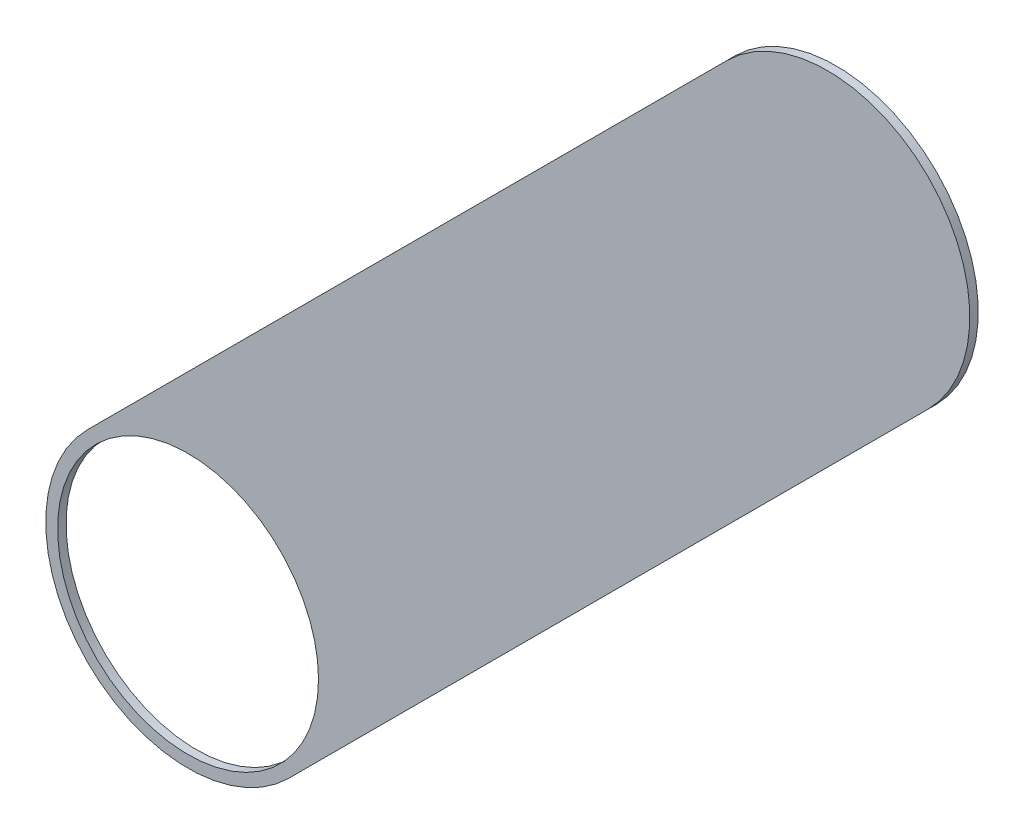
ISO-10303-21;
HEADER;
FILE_DESCRIPTION(('STEP AP214'),'2;1');
FILE_NAME('part.step','',(''),(''),'','','');
FILE_SCHEMA(('AUTOMOTIVE_DESIGN { 1 0 10303 214 1 1 1 1 }'));
ENDSEC;
DATA;
#1=APPLICATION_CONTEXT('core data for automotive mechanical design processes');
#2=APPLICATION_PROTOCOL_DEFINITION('international standard','automotive_design',2000,#1);
#3=PRODUCT_CONTEXT('',#1,'mechanical');
#4=PRODUCT('Part','Part','',(#3));
#5=PRODUCT_RELATED_PRODUCT_CATEGORY('part','',(#4));
#6=PRODUCT_DEFINITION_FORMATION('','',#4);
#7=PRODUCT_DEFINITION_CONTEXT('part definition',#1,'design');
#8=PRODUCT_DEFINITION('design','',#6,#7);
#9=PRODUCT_DEFINITION_SHAPE('','',#8);
#10=(LENGTH_UNIT() NAMED_UNIT(*) SI_UNIT(.MILLI.,.METRE.));
#11=(NAMED_UNIT(*) PLANE_ANGLE_UNIT() SI_UNIT($,.RADIAN.));
#12=(NAMED_UNIT(*) SI_UNIT($,.STERADIAN.) SOLID_ANGLE_UNIT());
#13=UNCERTAINTY_MEASURE_WITH_UNIT(LENGTH_MEASURE(1.E-05),#10,'distance_accuracy_value','');
#14=(GEOMETRIC_REPRESENTATION_CONTEXT(3) GLOBAL_UNCERTAINTY_ASSIGNED_CONTEXT((#13)) GLOBAL_UNIT_ASSIGNED_CONTEXT((#10,
#11,#12)) REPRESENTATION_CONTEXT('',''));
#15=CARTESIAN_POINT('',(0.,0.,0.));
#16=DIRECTION('',(0.,0.,1.));
#17=DIRECTION('',(1.,0.,0.));
#18=AXIS2_PLACEMENT_3D('',#15,#16,#17);
#19=CARTESIAN_POINT('',(97.12841382,56.81240352,0.));
#20=DIRECTION('',(-0.707106781186549,0.707106781186546,0.));
#21=DIRECTION('',(0.707106781186546,0.707106781186549,0.));
#22=AXIS2_PLACEMENT_3D('',#19,#20,#21);
#23=PLANE('',#22);
#24=DIRECTION('',(0.707106781186546,0.707106781186549,0.));
#25=VECTOR('',#24,1.);
#26=CARTESIAN_POINT('',(97.12841382,56.81240352,0.03556));
#27=LINE('',#26,#25);
#28=CARTESIAN_POINT('',(97.12841382,56.81240352,0.03556));
#29=VERTEX_POINT('',#28);
#30=CARTESIAN_POINT('',(99.8242606,59.5082503,0.03556));
#31=VERTEX_POINT('',#30);
#32=EDGE_CURVE('E11',#29,#31,#27,.T.);
#33=ORIENTED_EDGE('',*,*,#32,.F.);
#34=DIRECTION('',(0.,0.,1.));
#35=VECTOR('',#34,1.);
#36=CARTESIAN_POINT('',(97.12841382,56.81240352,0.));
#37=LINE('',#36,#35);
#38=CARTESIAN_POINT('',(97.12841382,56.81240352,0.));
#39=VERTEX_POINT('',#38);
#40=EDGE_CURVE('E24',#39,#29,#37,.T.);
#41=ORIENTED_EDGE('',*,*,#40,.F.);
#42=DIRECTION('',(0.707106781186546,0.707106781186549,0.));
#43=VECTOR('',#42,1.);
#44=CARTESIAN_POINT('',(97.12841382,56.81240352,0.));
#45=LINE('',#44,#43);
#46=CARTESIAN_POINT('',(99.8242606,59.5082503,0.));
#47=VERTEX_POINT('',#46);
#48=EDGE_CURVE('E96',#39,#47,#45,.T.);
#49=ORIENTED_EDGE('',*,*,#48,.T.);
#50=DIRECTION('',(0.,0.,1.));
#51=VECTOR('',#50,1.);
#52=CARTESIAN_POINT('',(99.8242606,59.5082503,0.));
#53=LINE('',#52,#51);
#54=EDGE_CURVE('E37',#47,#31,#53,.T.);
#55=ORIENTED_EDGE('',*,*,#54,.T.);
#56=EDGE_LOOP('',(#33,#41,#49,#55));
#57=FACE_BOUND('',#56,.T.);
#58=ADVANCED_FACE('F17',(#57),#23,.F.);
#59=CARTESIAN_POINT('',(96.70415127,57.23666607,0.));
#60=DIRECTION('',(0.,0.,-1.));
#61=DIRECTION('',(-0.707106781186542,0.707106781186554,0.));
#62=AXIS2_PLACEMENT_3D('',#59,#60,#61);
#63=CYLINDRICAL_SURFACE('',#62,0.599997852216994);
#64=CARTESIAN_POINT('',(96.70415127,57.23666607,0.03556));
#65=DIRECTION('',(0.,0.,1.));
#66=DIRECTION('',(-0.707106781186542,0.707106781186554,0.));
#67=AXIS2_PLACEMENT_3D('',#64,#65,#66);
#68=CIRCLE('',#67,0.599997852216994);
#69=CARTESIAN_POINT('',(96.27988872,57.66092862,0.03556));
#70=VERTEX_POINT('',#69);
#71=EDGE_CURVE('E92',#70,#29,#68,.T.);
#72=ORIENTED_EDGE('',*,*,#71,.F.);
#73=DIRECTION('',(0.,0.,1.));
#74=VECTOR('',#73,1.);
#75=CARTESIAN_POINT('',(96.27988872,57.66092862,0.));
#76=LINE('',#75,#74);
#77=CARTESIAN_POINT('',(96.27988872,57.66092862,0.));
#78=VERTEX_POINT('',#77);
#79=EDGE_CURVE('E90',#78,#70,#76,.T.);
#80=ORIENTED_EDGE('',*,*,#79,.F.);
#81=CARTESIAN_POINT('',(96.70415127,57.23666607,0.));
#82=DIRECTION('',(0.,0.,1.));
#83=DIRECTION('',(-0.707106781186542,0.707106781186554,0.));
#84=AXIS2_PLACEMENT_3D('',#81,#82,#83);
#85=CIRCLE('',#84,0.599997852216994);
#86=EDGE_CURVE('E88',#78,#39,#85,.T.);
#87=ORIENTED_EDGE('',*,*,#86,.T.);
#88=ORIENTED_EDGE('',*,*,#40,.T.);
#89=EDGE_LOOP('',(#72,#80,#87,#88));
#90=FACE_BOUND('',#89,.T.);
#91=ADVANCED_FACE('F111',(#90),#63,.T.);
#92=CARTESIAN_POINT('',(99.39999805,59.93251285,0.));
#93=DIRECTION('',(0.,0.,-1.));
#94=DIRECTION('',(0.707106781186548,-0.707106781186548,0.));
#95=AXIS2_PLACEMENT_3D('',#92,#93,#94);
#96=CYLINDRICAL_SURFACE('',#95,0.599997852216989);
#97=CARTESIAN_POINT('',(99.39999805,59.93251285,0.03556));
#98=DIRECTION('',(0.,0.,1.));
#99=DIRECTION('',(0.707106781186548,-0.707106781186548,0.));
#100=AXIS2_PLACEMENT_3D('',#97,#98,#99);
#101=CIRCLE('',#100,0.599997852216989);
#102=CARTESIAN_POINT('',(98.9757355,60.3567754,0.03556));
#103=VERTEX_POINT('',#102);
#104=EDGE_CURVE('E85',#31,#103,#101,.T.);
#105=ORIENTED_EDGE('',*,*,#104,.F.);
#106=ORIENTED_EDGE('',*,*,#54,.F.);
#107=CARTESIAN_POINT('',(99.39999805,59.93251285,0.));
#108=DIRECTION('',(0.,0.,1.));
#109=DIRECTION('',(0.707106781186548,-0.707106781186548,0.));
#110=AXIS2_PLACEMENT_3D('',#107,#108,#109);
#111=CIRCLE('',#110,0.599997852216989);
#112=CARTESIAN_POINT('',(98.9757355,60.3567754,0.));
#113=VERTEX_POINT('',#112);
#114=EDGE_CURVE('E82',#47,#113,#111,.T.);
#115=ORIENTED_EDGE('',*,*,#114,.T.);
#116=DIRECTION('',(0.,0.,1.));
#117=VECTOR('',#116,1.);
#118=CARTESIAN_POINT('',(98.9757355,60.3567754,0.));
#119=LINE('',#118,#117);
#120=EDGE_CURVE('E80',#113,#103,#119,.T.);
#121=ORIENTED_EDGE('',*,*,#120,.T.);
#122=EDGE_LOOP('',(#105,#106,#115,#121));
#123=FACE_BOUND('',#122,.T.);
#124=ADVANCED_FACE('F104',(#123),#96,.T.);
#125=CARTESIAN_POINT('',(98.9757355,60.3567754,0.));
#126=DIRECTION('',(0.707106781186548,-0.707106781186548,0.));
#127=DIRECTION('',(-0.707106781186548,-0.707106781186548,0.));
#128=AXIS2_PLACEMENT_3D('',#125,#126,#127);
#129=PLANE('',#128);
#130=DIRECTION('',(-0.707106781186548,-0.707106781186548,0.));
#131=VECTOR('',#130,1.);
#132=CARTESIAN_POINT('',(98.9757355,60.3567754,0.03556));
#133=LINE('',#132,#131);
#134=EDGE_CURVE('E77',#103,#70,#133,.T.);
#135=ORIENTED_EDGE('',*,*,#134,.F.);
#136=ORIENTED_EDGE('',*,*,#120,.F.);
#137=DIRECTION('',(-0.707106781186548,-0.707106781186548,0.));
#138=VECTOR('',#137,1.);
#139=CARTESIAN_POINT('',(98.9757355,60.3567754,0.));
#140=LINE('',#139,#138);
#141=EDGE_CURVE('E68',#113,#78,#140,.T.);
#142=ORIENTED_EDGE('',*,*,#141,.T.);
#143=ORIENTED_EDGE('',*,*,#79,.T.);
#144=EDGE_LOOP('',(#135,#136,#142,#143));
#145=FACE_BOUND('',#144,.T.);
#146=ADVANCED_FACE('F110',(#145),#129,.F.);
#147=CARTESIAN_POINT('',(96.70415,57.2366648,0.));
#148=DIRECTION('',(0.,0.,-1.));
#149=DIRECTION('',(1.,0.,0.));
#150=AXIS2_PLACEMENT_3D('',#147,#148,#149);
#151=CYLINDRICAL_SURFACE('',#150,0.5499989);
#152=DIRECTION('',(0.,0.,1.));
#153=VECTOR('',#152,1.);
#154=CARTESIAN_POINT('',(97.2541489,57.2366648,0.));
#155=LINE('',#154,#153);
#156=CARTESIAN_POINT('',(97.2541489,57.2366648,0.));
#157=VERTEX_POINT('',#156);
#158=CARTESIAN_POINT('',(97.2541489,57.2366648,0.03556));
#159=VERTEX_POINT('',#158);
#160=EDGE_CURVE('E62',#157,#159,#155,.T.);
#161=ORIENTED_EDGE('',*,*,#160,.T.);
#162=CARTESIAN_POINT('',(96.70415,57.2366648,0.03556));
#163=DIRECTION('',(0.,0.,1.));
#164=DIRECTION('',(1.,0.,0.));
#165=AXIS2_PLACEMENT_3D('',#162,#163,#164);
#166=CIRCLE('',#165,0.5499989);
#167=EDGE_CURVE('E67',#159,#159,#166,.T.);
#168=ORIENTED_EDGE('',*,*,#167,.T.);
#169=ORIENTED_EDGE('',*,*,#160,.F.);
#170=CARTESIAN_POINT('',(96.70415,57.2366648,0.));
#171=DIRECTION('',(0.,0.,1.));
#172=DIRECTION('',(1.,0.,0.));
#173=AXIS2_PLACEMENT_3D('',#170,#171,#172);
#174=CIRCLE('',#173,0.5499989);
#175=EDGE_CURVE('E65',#157,#157,#174,.T.);
#176=ORIENTED_EDGE('',*,*,#175,.F.);
#177=EDGE_LOOP('',(#161,#168,#169,#176));
#178=FACE_BOUND('',#177,.T.);
#179=ADVANCED_FACE('F64',(#178),#151,.F.);
#180=CARTESIAN_POINT('',(97.12841382,56.81240352,0.));
#181=DIRECTION('',(0.,0.,-1.));
#182=DIRECTION('',(-1.,0.,0.));
#183=AXIS2_PLACEMENT_3D('',#180,#181,#182);
#184=PLANE('',#183);
#185=ORIENTED_EDGE('',*,*,#48,.F.);
#186=ORIENTED_EDGE('',*,*,#86,.F.);
#187=ORIENTED_EDGE('',*,*,#141,.F.);
#188=ORIENTED_EDGE('',*,*,#114,.F.);
#189=EDGE_LOOP('',(#185,#186,#187,#188));
#190=FACE_BOUND('',#189,.T.);
#191=ORIENTED_EDGE('',*,*,#175,.T.);
#192=EDGE_LOOP('',(#191));
#193=FACE_BOUND('',#192,.T.);
#194=ADVANCED_FACE('F71',(#190,#193),#184,.T.);
#195=CARTESIAN_POINT('',(97.12841382,56.81240352,0.03556));
#196=DIRECTION('',(0.,0.,-1.));
#197=DIRECTION('',(-1.,0.,0.));
#198=AXIS2_PLACEMENT_3D('',#195,#196,#197);
#199=PLANE('',#198);
#200=ORIENTED_EDGE('',*,*,#134,.T.);
#201=ORIENTED_EDGE('',*,*,#71,.T.);
#202=ORIENTED_EDGE('',*,*,#32,.T.);
#203=ORIENTED_EDGE('',*,*,#104,.T.);
#204=EDGE_LOOP('',(#200,#201,#202,#203));
#205=FACE_BOUND('',#204,.T.);
#206=ORIENTED_EDGE('',*,*,#167,.F.);
#207=EDGE_LOOP('',(#206));
#208=FACE_BOUND('',#207,.T.);
#209=ADVANCED_FACE('F107',(#205,#208),#199,.F.);
#210=CLOSED_SHELL('',(#58,#91,#124,#146,#179,#194,#209));
#211=MANIFOLD_SOLID_BREP('B1',#210);
#212=ADVANCED_BREP_SHAPE_REPRESENTATION('',(#18,#211),#14);
#213=SHAPE_DEFINITION_REPRESENTATION(#9,#212);
ENDSEC;
END-ISO-10303-21;
